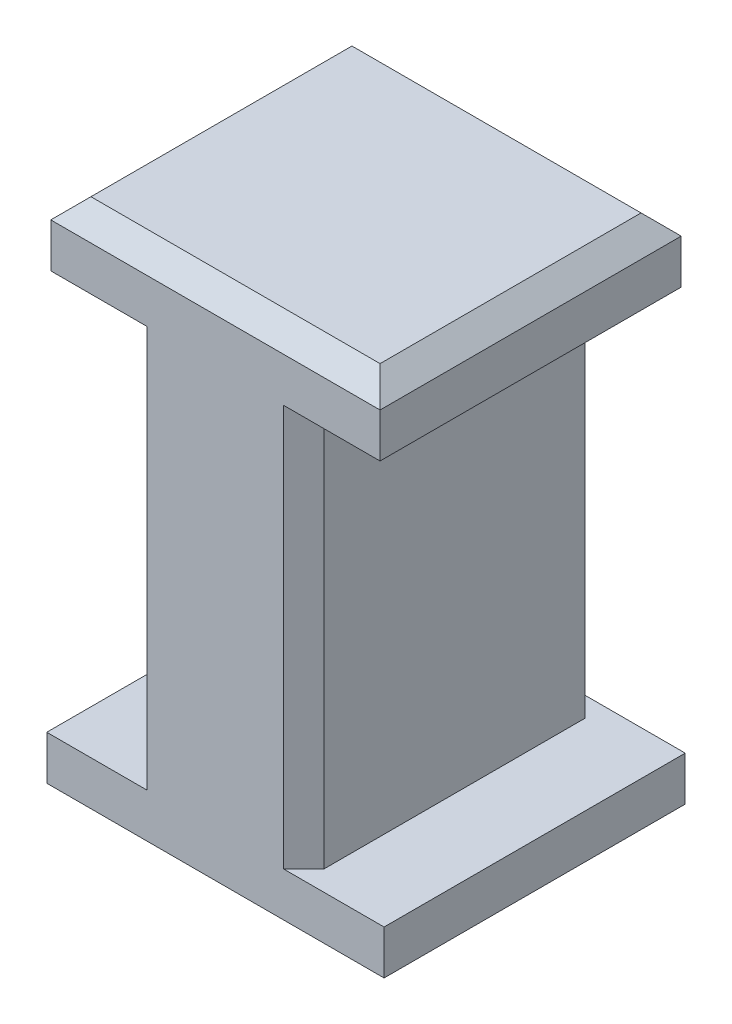
ISO-10303-21;
HEADER;
FILE_DESCRIPTION(('STEP AP214'),'2;1');
FILE_NAME('part.step','',(''),(''),'','','');
FILE_SCHEMA(('AUTOMOTIVE_DESIGN { 1 0 10303 214 1 1 1 1 }'));
ENDSEC;
DATA;
#1=APPLICATION_CONTEXT('core data for automotive mechanical design processes');
#2=APPLICATION_PROTOCOL_DEFINITION('international standard','automotive_design',2000,#1);
#3=PRODUCT_CONTEXT('',#1,'mechanical');
#4=PRODUCT('Part','Part','',(#3));
#5=PRODUCT_RELATED_PRODUCT_CATEGORY('part','',(#4));
#6=PRODUCT_DEFINITION_FORMATION('','',#4);
#7=PRODUCT_DEFINITION_CONTEXT('part definition',#1,'design');
#8=PRODUCT_DEFINITION('design','',#6,#7);
#9=PRODUCT_DEFINITION_SHAPE('','',#8);
#10=(LENGTH_UNIT() NAMED_UNIT(*) SI_UNIT(.MILLI.,.METRE.));
#11=(NAMED_UNIT(*) PLANE_ANGLE_UNIT() SI_UNIT($,.RADIAN.));
#12=(NAMED_UNIT(*) SI_UNIT($,.STERADIAN.) SOLID_ANGLE_UNIT());
#13=UNCERTAINTY_MEASURE_WITH_UNIT(LENGTH_MEASURE(1.E-05),#10,'distance_accuracy_value','');
#14=(GEOMETRIC_REPRESENTATION_CONTEXT(3) GLOBAL_UNCERTAINTY_ASSIGNED_CONTEXT((#13)) GLOBAL_UNIT_ASSIGNED_CONTEXT((#10,
#11,#12)) REPRESENTATION_CONTEXT('',''));
#15=CARTESIAN_POINT('',(0.,0.,0.));
#16=DIRECTION('',(0.,0.,1.));
#17=DIRECTION('',(1.,0.,0.));
#18=AXIS2_PLACEMENT_3D('',#15,#16,#17);
#19=CARTESIAN_POINT('',(8.2,23.2,15.));
#20=DIRECTION('',(-1.,0.,0.));
#21=DIRECTION('',(0.,0.,1.));
#22=AXIS2_PLACEMENT_3D('',#19,#20,#21);
#23=PLANE('',#22);
#24=DIRECTION('',(0.,1.,0.));
#25=VECTOR('',#24,1.);
#26=CARTESIAN_POINT('',(8.2,23.2,0.));
#27=LINE('',#26,#25);
#28=CARTESIAN_POINT('',(8.2,23.2,0.));
#29=VERTEX_POINT('',#28);
#30=CARTESIAN_POINT('',(8.2,25.4,0.));
#31=VERTEX_POINT('',#30);
#32=EDGE_CURVE('E216',#29,#31,#27,.T.);
#33=ORIENTED_EDGE('',*,*,#32,.T.);
#34=DIRECTION('',(0.,0.,1.));
#35=VECTOR('',#34,1.);
#36=CARTESIAN_POINT('',(8.2,25.4,15.));
#37=LINE('',#36,#35);
#38=CARTESIAN_POINT('',(8.2,25.4,15.));
#39=VERTEX_POINT('',#38);
#40=EDGE_CURVE('E260',#31,#39,#37,.T.);
#41=ORIENTED_EDGE('',*,*,#40,.T.);
#42=DIRECTION('',(0.,1.,0.));
#43=VECTOR('',#42,1.);
#44=CARTESIAN_POINT('',(8.2,23.2,15.));
#45=LINE('',#44,#43);
#46=CARTESIAN_POINT('',(8.2,23.2,15.));
#47=VERTEX_POINT('',#46);
#48=EDGE_CURVE('E196',#47,#39,#45,.T.);
#49=ORIENTED_EDGE('',*,*,#48,.F.);
#50=DIRECTION('',(0.,0.,-1.));
#51=VECTOR('',#50,1.);
#52=CARTESIAN_POINT('',(8.2,23.2,15.));
#53=LINE('',#52,#51);
#54=EDGE_CURVE('E215',#47,#29,#53,.T.);
#55=ORIENTED_EDGE('',*,*,#54,.T.);
#56=EDGE_LOOP('',(#33,#41,#49,#55));
#57=FACE_BOUND('',#56,.T.);
#58=ADVANCED_FACE('F34',(#57),#23,.F.);
#59=CARTESIAN_POINT('',(8.2,26.4,15.));
#60=DIRECTION('',(0.,-1.,0.));
#61=DIRECTION('',(0.,0.,-1.));
#62=AXIS2_PLACEMENT_3D('',#59,#60,#61);
#63=PLANE('',#62);
#64=DIRECTION('',(1.,0.,0.));
#65=VECTOR('',#64,1.);
#66=CARTESIAN_POINT('',(8.2,26.4,14.));
#67=LINE('',#66,#65);
#68=CARTESIAN_POINT('',(-7.19999999999999,26.4,14.));
#69=VERTEX_POINT('',#68);
#70=CARTESIAN_POINT('',(7.19999999999999,26.4,14.));
#71=VERTEX_POINT('',#70);
#72=EDGE_CURVE('E255',#69,#71,#67,.T.);
#73=ORIENTED_EDGE('',*,*,#72,.T.);
#74=DIRECTION('',(0.,0.,-1.));
#75=VECTOR('',#74,1.);
#76=CARTESIAN_POINT('',(7.19999999999999,26.4,15.));
#77=LINE('',#76,#75);
#78=CARTESIAN_POINT('',(7.19999999999999,26.4,1.));
#79=VERTEX_POINT('',#78);
#80=EDGE_CURVE('E257',#71,#79,#77,.T.);
#81=ORIENTED_EDGE('',*,*,#80,.T.);
#82=DIRECTION('',(-1.,0.,0.));
#83=VECTOR('',#82,1.);
#84=CARTESIAN_POINT('',(8.2,26.4,1.));
#85=LINE('',#84,#83);
#86=CARTESIAN_POINT('',(-7.19999999999999,26.4,1.));
#87=VERTEX_POINT('',#86);
#88=EDGE_CURVE('E185',#79,#87,#85,.T.);
#89=ORIENTED_EDGE('',*,*,#88,.T.);
#90=DIRECTION('',(0.,0.,1.));
#91=VECTOR('',#90,1.);
#92=CARTESIAN_POINT('',(-7.19999999999999,26.4,15.));
#93=LINE('',#92,#91);
#94=EDGE_CURVE('E253',#87,#69,#93,.T.);
#95=ORIENTED_EDGE('',*,*,#94,.T.);
#96=EDGE_LOOP('',(#73,#81,#89,#95));
#97=FACE_BOUND('',#96,.T.);
#98=ADVANCED_FACE('F384',(#97),#63,.F.);
#99=CARTESIAN_POINT('',(-8.2,23.2,15.));
#100=DIRECTION('',(-1.,0.,0.));
#101=DIRECTION('',(0.,0.,1.));
#102=AXIS2_PLACEMENT_3D('',#99,#100,#101);
#103=PLANE('',#102);
#104=DIRECTION('',(0.,1.,0.));
#105=VECTOR('',#104,1.);
#106=CARTESIAN_POINT('',(-8.2,23.2,15.));
#107=LINE('',#106,#105);
#108=CARTESIAN_POINT('',(-8.2,23.2,15.));
#109=VERTEX_POINT('',#108);
#110=CARTESIAN_POINT('',(-8.2,25.4,15.));
#111=VERTEX_POINT('',#110);
#112=EDGE_CURVE('E178',#109,#111,#107,.T.);
#113=ORIENTED_EDGE('',*,*,#112,.T.);
#114=DIRECTION('',(0.,0.,-1.));
#115=VECTOR('',#114,1.);
#116=CARTESIAN_POINT('',(-8.2,25.4,0.));
#117=LINE('',#116,#115);
#118=CARTESIAN_POINT('',(-8.2,25.4,0.));
#119=VERTEX_POINT('',#118);
#120=EDGE_CURVE('E271',#111,#119,#117,.T.);
#121=ORIENTED_EDGE('',*,*,#120,.T.);
#122=DIRECTION('',(0.,1.,0.));
#123=VECTOR('',#122,1.);
#124=CARTESIAN_POINT('',(-8.2,23.2,0.));
#125=LINE('',#124,#123);
#126=CARTESIAN_POINT('',(-8.2,23.2,0.));
#127=VERTEX_POINT('',#126);
#128=EDGE_CURVE('E181',#127,#119,#125,.T.);
#129=ORIENTED_EDGE('',*,*,#128,.F.);
#130=DIRECTION('',(0.,0.,-1.));
#131=VECTOR('',#130,1.);
#132=CARTESIAN_POINT('',(-8.2,23.2,15.));
#133=LINE('',#132,#131);
#134=EDGE_CURVE('E175',#109,#127,#133,.T.);
#135=ORIENTED_EDGE('',*,*,#134,.F.);
#136=EDGE_LOOP('',(#113,#121,#129,#135));
#137=FACE_BOUND('',#136,.T.);
#138=ADVANCED_FACE('F177',(#137),#103,.T.);
#139=CARTESIAN_POINT('',(-4.4,23.2,15.));
#140=DIRECTION('',(0.,-1.,0.));
#141=DIRECTION('',(1.,0.,0.));
#142=AXIS2_PLACEMENT_3D('',#139,#140,#141);
#143=PLANE('',#142);
#144=DIRECTION('',(-1.,0.,0.));
#145=VECTOR('',#144,1.);
#146=CARTESIAN_POINT('',(-4.4,23.2,0.));
#147=LINE('',#146,#145);
#148=CARTESIAN_POINT('',(-3.4,23.2,0.));
#149=VERTEX_POINT('',#148);
#150=EDGE_CURVE('E221',#149,#127,#147,.T.);
#151=ORIENTED_EDGE('',*,*,#150,.F.);
#152=DIRECTION('',(-0.707106781186546,0.,0.707106781186549));
#153=VECTOR('',#152,1.);
#154=CARTESIAN_POINT('',(-3.40000000000001,23.2,0.));
#155=LINE('',#154,#153);
#156=CARTESIAN_POINT('',(-4.4,23.2,1.00000000000001));
#157=VERTEX_POINT('',#156);
#158=EDGE_CURVE('E313',#149,#157,#155,.T.);
#159=ORIENTED_EDGE('',*,*,#158,.T.);
#160=DIRECTION('',(0.,0.,-1.));
#161=VECTOR('',#160,1.);
#162=CARTESIAN_POINT('',(-4.4,23.2,15.));
#163=LINE('',#162,#161);
#164=CARTESIAN_POINT('',(-4.4,23.2,14.));
#165=VERTEX_POINT('',#164);
#166=EDGE_CURVE('E186',#165,#157,#163,.T.);
#167=ORIENTED_EDGE('',*,*,#166,.F.);
#168=DIRECTION('',(-0.707106781186549,0.,-0.707106781186546));
#169=VECTOR('',#168,1.);
#170=CARTESIAN_POINT('',(-4.40000000000001,23.2,14.));
#171=LINE('',#170,#169);
#172=CARTESIAN_POINT('',(-3.39999999999999,23.2,15.));
#173=VERTEX_POINT('',#172);
#174=EDGE_CURVE('E200',#165,#173,#171,.F.);
#175=ORIENTED_EDGE('',*,*,#174,.T.);
#176=DIRECTION('',(-1.,0.,0.));
#177=VECTOR('',#176,1.);
#178=CARTESIAN_POINT('',(-4.4,23.2,15.));
#179=LINE('',#178,#177);
#180=EDGE_CURVE('E192',#173,#109,#179,.T.);
#181=ORIENTED_EDGE('',*,*,#180,.T.);
#182=ORIENTED_EDGE('',*,*,#134,.T.);
#183=EDGE_LOOP('',(#151,#159,#167,#175,#181,#182));
#184=FACE_BOUND('',#183,.T.);
#185=ADVANCED_FACE('F198',(#184),#143,.T.);
#186=CARTESIAN_POINT('',(-4.4,3.2,15.));
#187=DIRECTION('',(-1.,0.,0.));
#188=DIRECTION('',(0.,0.,1.));
#189=AXIS2_PLACEMENT_3D('',#186,#187,#188);
#190=PLANE('',#189);
#191=DIRECTION('',(0.,0.,-1.));
#192=VECTOR('',#191,1.);
#193=CARTESIAN_POINT('',(-4.4,3.2,15.));
#194=LINE('',#193,#192);
#195=CARTESIAN_POINT('',(-4.4,3.2,14.));
#196=VERTEX_POINT('',#195);
#197=CARTESIAN_POINT('',(-4.4,3.2,1.00000000000001));
#198=VERTEX_POINT('',#197);
#199=EDGE_CURVE('E247',#196,#198,#194,.T.);
#200=ORIENTED_EDGE('',*,*,#199,.F.);
#201=DIRECTION('',(0.,1.,0.));
#202=VECTOR('',#201,1.);
#203=CARTESIAN_POINT('',(-4.4,3.2,14.));
#204=LINE('',#203,#202);
#205=EDGE_CURVE('E285',#196,#165,#204,.T.);
#206=ORIENTED_EDGE('',*,*,#205,.T.);
#207=ORIENTED_EDGE('',*,*,#166,.T.);
#208=DIRECTION('',(0.,-1.,0.));
#209=VECTOR('',#208,1.);
#210=CARTESIAN_POINT('',(-4.4,3.2,1.00000000000001));
#211=LINE('',#210,#209);
#212=EDGE_CURVE('E283',#157,#198,#211,.T.);
#213=ORIENTED_EDGE('',*,*,#212,.T.);
#214=EDGE_LOOP('',(#200,#206,#207,#213));
#215=FACE_BOUND('',#214,.T.);
#216=ADVANCED_FACE('F557',(#215),#190,.T.);
#217=CARTESIAN_POINT('',(-8.4,3.2,15.));
#218=DIRECTION('',(0.,1.,0.));
#219=DIRECTION('',(-1.,0.,0.));
#220=AXIS2_PLACEMENT_3D('',#217,#218,#219);
#221=PLANE('',#220);
#222=DIRECTION('',(1.,0.,0.));
#223=VECTOR('',#222,1.);
#224=CARTESIAN_POINT('',(-8.4,3.2,0.));
#225=LINE('',#224,#223);
#226=CARTESIAN_POINT('',(-8.4,3.2,0.));
#227=VERTEX_POINT('',#226);
#228=CARTESIAN_POINT('',(-3.4,3.2,0.));
#229=VERTEX_POINT('',#228);
#230=EDGE_CURVE('E223',#227,#229,#225,.T.);
#231=ORIENTED_EDGE('',*,*,#230,.F.);
#232=DIRECTION('',(0.,0.,-1.));
#233=VECTOR('',#232,1.);
#234=CARTESIAN_POINT('',(-8.4,3.2,15.));
#235=LINE('',#234,#233);
#236=CARTESIAN_POINT('',(-8.4,3.2,15.));
#237=VERTEX_POINT('',#236);
#238=EDGE_CURVE('E244',#237,#227,#235,.T.);
#239=ORIENTED_EDGE('',*,*,#238,.F.);
#240=DIRECTION('',(1.,0.,0.));
#241=VECTOR('',#240,1.);
#242=CARTESIAN_POINT('',(-8.4,3.2,15.));
#243=LINE('',#242,#241);
#244=CARTESIAN_POINT('',(-3.39999999999999,3.2,15.));
#245=VERTEX_POINT('',#244);
#246=EDGE_CURVE('E202',#237,#245,#243,.T.);
#247=ORIENTED_EDGE('',*,*,#246,.T.);
#248=DIRECTION('',(0.707106781186549,0.,0.707106781186546));
#249=VECTOR('',#248,1.);
#250=CARTESIAN_POINT('',(-4.4,3.2,14.));
#251=LINE('',#250,#249);
#252=EDGE_CURVE('E306',#245,#196,#251,.F.);
#253=ORIENTED_EDGE('',*,*,#252,.T.);
#254=ORIENTED_EDGE('',*,*,#199,.T.);
#255=DIRECTION('',(0.707106781186546,0.,-0.707106781186549));
#256=VECTOR('',#255,1.);
#257=CARTESIAN_POINT('',(-3.4,3.2,0.));
#258=LINE('',#257,#256);
#259=EDGE_CURVE('E315',#198,#229,#258,.T.);
#260=ORIENTED_EDGE('',*,*,#259,.T.);
#261=EDGE_LOOP('',(#231,#239,#247,#253,#254,#260));
#262=FACE_BOUND('',#261,.T.);
#263=ADVANCED_FACE('F369',(#262),#221,.T.);
#264=CARTESIAN_POINT('',(-8.4,0.,15.));
#265=DIRECTION('',(-1.,0.,0.));
#266=DIRECTION('',(0.,0.,1.));
#267=AXIS2_PLACEMENT_3D('',#264,#265,#266);
#268=PLANE('',#267);
#269=DIRECTION('',(0.,1.,0.));
#270=VECTOR('',#269,1.);
#271=CARTESIAN_POINT('',(-8.4,0.,0.));
#272=LINE('',#271,#270);
#273=CARTESIAN_POINT('',(-8.4,1.,0.));
#274=VERTEX_POINT('',#273);
#275=EDGE_CURVE('E225',#274,#227,#272,.T.);
#276=ORIENTED_EDGE('',*,*,#275,.F.);
#277=DIRECTION('',(0.,0.,1.));
#278=VECTOR('',#277,1.);
#279=CARTESIAN_POINT('',(-8.4,1.,15.));
#280=LINE('',#279,#278);
#281=CARTESIAN_POINT('',(-8.4,1.,15.));
#282=VERTEX_POINT('',#281);
#283=EDGE_CURVE('E300',#274,#282,#280,.T.);
#284=ORIENTED_EDGE('',*,*,#283,.T.);
#285=DIRECTION('',(0.,1.,0.));
#286=VECTOR('',#285,1.);
#287=CARTESIAN_POINT('',(-8.4,0.,15.));
#288=LINE('',#287,#286);
#289=EDGE_CURVE('E204',#282,#237,#288,.T.);
#290=ORIENTED_EDGE('',*,*,#289,.T.);
#291=ORIENTED_EDGE('',*,*,#238,.T.);
#292=EDGE_LOOP('',(#276,#284,#290,#291));
#293=FACE_BOUND('',#292,.T.);
#294=ADVANCED_FACE('F366',(#293),#268,.T.);
#295=CARTESIAN_POINT('',(-8.4,0.,15.));
#296=DIRECTION('',(0.,1.,0.));
#297=DIRECTION('',(0.,0.,1.));
#298=AXIS2_PLACEMENT_3D('',#295,#296,#297);
#299=PLANE('',#298);
#300=DIRECTION('',(-1.,0.,0.));
#301=VECTOR('',#300,1.);
#302=CARTESIAN_POINT('',(-8.4,0.,14.));
#303=LINE('',#302,#301);
#304=CARTESIAN_POINT('',(7.39999999999999,0.,14.));
#305=VERTEX_POINT('',#304);
#306=CARTESIAN_POINT('',(-7.39999999999999,0.,14.));
#307=VERTEX_POINT('',#306);
#308=EDGE_CURVE('E293',#305,#307,#303,.T.);
#309=ORIENTED_EDGE('',*,*,#308,.T.);
#310=DIRECTION('',(0.,0.,-1.));
#311=VECTOR('',#310,1.);
#312=CARTESIAN_POINT('',(-7.39999999999999,0.,0.));
#313=LINE('',#312,#311);
#314=CARTESIAN_POINT('',(-7.39999999999999,0.,1.00000000000001));
#315=VERTEX_POINT('',#314);
#316=EDGE_CURVE('E298',#307,#315,#313,.T.);
#317=ORIENTED_EDGE('',*,*,#316,.T.);
#318=DIRECTION('',(1.,0.,0.));
#319=VECTOR('',#318,1.);
#320=CARTESIAN_POINT('',(-8.4,0.,1.00000000000001));
#321=LINE('',#320,#319);
#322=CARTESIAN_POINT('',(7.39999999999999,0.,1.00000000000001));
#323=VERTEX_POINT('',#322);
#324=EDGE_CURVE('E59',#315,#323,#321,.T.);
#325=ORIENTED_EDGE('',*,*,#324,.T.);
#326=DIRECTION('',(0.,0.,1.));
#327=VECTOR('',#326,1.);
#328=CARTESIAN_POINT('',(7.39999999999999,0.,15.));
#329=LINE('',#328,#327);
#330=EDGE_CURVE('E295',#323,#305,#329,.T.);
#331=ORIENTED_EDGE('',*,*,#330,.T.);
#332=EDGE_LOOP('',(#309,#317,#325,#331));
#333=FACE_BOUND('',#332,.T.);
#334=ADVANCED_FACE('F374',(#333),#299,.F.);
#335=CARTESIAN_POINT('',(8.4,0.,15.));
#336=DIRECTION('',(-1.,0.,0.));
#337=DIRECTION('',(0.,0.,1.));
#338=AXIS2_PLACEMENT_3D('',#335,#336,#337);
#339=PLANE('',#338);
#340=DIRECTION('',(0.,1.,0.));
#341=VECTOR('',#340,1.);
#342=CARTESIAN_POINT('',(8.4,0.,15.));
#343=LINE('',#342,#341);
#344=CARTESIAN_POINT('',(8.4,1.,15.));
#345=VERTEX_POINT('',#344);
#346=CARTESIAN_POINT('',(8.4,3.2,15.));
#347=VERTEX_POINT('',#346);
#348=EDGE_CURVE('E209',#345,#347,#343,.T.);
#349=ORIENTED_EDGE('',*,*,#348,.F.);
#350=DIRECTION('',(0.,0.,-1.));
#351=VECTOR('',#350,1.);
#352=CARTESIAN_POINT('',(8.4,1.,15.));
#353=LINE('',#352,#351);
#354=CARTESIAN_POINT('',(8.4,1.,0.));
#355=VERTEX_POINT('',#354);
#356=EDGE_CURVE('E303',#345,#355,#353,.T.);
#357=ORIENTED_EDGE('',*,*,#356,.T.);
#358=DIRECTION('',(0.,1.,0.));
#359=VECTOR('',#358,1.);
#360=CARTESIAN_POINT('',(8.4,0.,0.));
#361=LINE('',#360,#359);
#362=CARTESIAN_POINT('',(8.4,3.2,0.));
#363=VERTEX_POINT('',#362);
#364=EDGE_CURVE('E227',#355,#363,#361,.T.);
#365=ORIENTED_EDGE('',*,*,#364,.T.);
#366=DIRECTION('',(0.,0.,-1.));
#367=VECTOR('',#366,1.);
#368=CARTESIAN_POINT('',(8.4,3.2,15.));
#369=LINE('',#368,#367);
#370=EDGE_CURVE('E241',#347,#363,#369,.T.);
#371=ORIENTED_EDGE('',*,*,#370,.F.);
#372=EDGE_LOOP('',(#349,#357,#365,#371));
#373=FACE_BOUND('',#372,.T.);
#374=ADVANCED_FACE('F348',(#373),#339,.F.);
#375=CARTESIAN_POINT('',(8.4,3.2,15.));
#376=DIRECTION('',(0.,-1.,0.));
#377=DIRECTION('',(1.,0.,0.));
#378=AXIS2_PLACEMENT_3D('',#375,#376,#377);
#379=PLANE('',#378);
#380=DIRECTION('',(-1.,0.,0.));
#381=VECTOR('',#380,1.);
#382=CARTESIAN_POINT('',(8.4,3.2,0.));
#383=LINE('',#382,#381);
#384=CARTESIAN_POINT('',(3.39999999999999,3.2,0.));
#385=VERTEX_POINT('',#384);
#386=EDGE_CURVE('E229',#363,#385,#383,.T.);
#387=ORIENTED_EDGE('',*,*,#386,.T.);
#388=DIRECTION('',(-0.707106781186549,0.,-0.707106781186546));
#389=VECTOR('',#388,1.);
#390=CARTESIAN_POINT('',(13.4,3.2,9.99999999999998));
#391=LINE('',#390,#389);
#392=CARTESIAN_POINT('',(4.4,3.2,1.));
#393=VERTEX_POINT('',#392);
#394=EDGE_CURVE('E11',#385,#393,#391,.F.);
#395=ORIENTED_EDGE('',*,*,#394,.T.);
#396=DIRECTION('',(0.,0.,-1.));
#397=VECTOR('',#396,1.);
#398=CARTESIAN_POINT('',(4.4,3.2,15.));
#399=LINE('',#398,#397);
#400=CARTESIAN_POINT('',(4.4,3.2,14.));
#401=VERTEX_POINT('',#400);
#402=EDGE_CURVE('E238',#401,#393,#399,.T.);
#403=ORIENTED_EDGE('',*,*,#402,.F.);
#404=DIRECTION('',(-0.707106781186546,0.,0.707106781186549));
#405=VECTOR('',#404,1.);
#406=CARTESIAN_POINT('',(5.89999999999999,3.2,12.5));
#407=LINE('',#406,#405);
#408=CARTESIAN_POINT('',(3.4,3.2,15.));
#409=VERTEX_POINT('',#408);
#410=EDGE_CURVE('E310',#401,#409,#407,.T.);
#411=ORIENTED_EDGE('',*,*,#410,.T.);
#412=DIRECTION('',(-1.,0.,0.));
#413=VECTOR('',#412,1.);
#414=CARTESIAN_POINT('',(8.4,3.2,15.));
#415=LINE('',#414,#413);
#416=EDGE_CURVE('E211',#347,#409,#415,.T.);
#417=ORIENTED_EDGE('',*,*,#416,.F.);
#418=ORIENTED_EDGE('',*,*,#370,.T.);
#419=EDGE_LOOP('',(#387,#395,#403,#411,#417,#418));
#420=FACE_BOUND('',#419,.T.);
#421=ADVANCED_FACE('F357',(#420),#379,.F.);
#422=CARTESIAN_POINT('',(4.4,3.2,15.));
#423=DIRECTION('',(-1.,0.,0.));
#424=DIRECTION('',(0.,0.,1.));
#425=AXIS2_PLACEMENT_3D('',#422,#423,#424);
#426=PLANE('',#425);
#427=DIRECTION('',(0.,0.,-1.));
#428=VECTOR('',#427,1.);
#429=CARTESIAN_POINT('',(4.4,23.2,15.));
#430=LINE('',#429,#428);
#431=CARTESIAN_POINT('',(4.4,23.2,14.));
#432=VERTEX_POINT('',#431);
#433=CARTESIAN_POINT('',(4.4,23.2,1.));
#434=VERTEX_POINT('',#433);
#435=EDGE_CURVE('E235',#432,#434,#430,.T.);
#436=ORIENTED_EDGE('',*,*,#435,.F.);
#437=DIRECTION('',(0.,-1.,0.));
#438=VECTOR('',#437,1.);
#439=CARTESIAN_POINT('',(4.4,3.2,14.));
#440=LINE('',#439,#438);
#441=EDGE_CURVE('E291',#432,#401,#440,.T.);
#442=ORIENTED_EDGE('',*,*,#441,.T.);
#443=ORIENTED_EDGE('',*,*,#402,.T.);
#444=DIRECTION('',(0.,1.,0.));
#445=VECTOR('',#444,1.);
#446=CARTESIAN_POINT('',(4.4,3.2,1.));
#447=LINE('',#446,#445);
#448=EDGE_CURVE('E288',#393,#434,#447,.T.);
#449=ORIENTED_EDGE('',*,*,#448,.T.);
#450=EDGE_LOOP('',(#436,#442,#443,#449));
#451=FACE_BOUND('',#450,.T.);
#452=ADVANCED_FACE('F519',(#451),#426,.F.);
#453=CARTESIAN_POINT('',(4.4,23.2,15.));
#454=DIRECTION('',(0.,1.,0.));
#455=DIRECTION('',(-1.,0.,0.));
#456=AXIS2_PLACEMENT_3D('',#453,#454,#455);
#457=PLANE('',#456);
#458=DIRECTION('',(1.,0.,0.));
#459=VECTOR('',#458,1.);
#460=CARTESIAN_POINT('',(4.4,23.2,0.));
#461=LINE('',#460,#459);
#462=CARTESIAN_POINT('',(3.39999999999999,23.2,0.));
#463=VERTEX_POINT('',#462);
#464=EDGE_CURVE('E231',#463,#29,#461,.T.);
#465=ORIENTED_EDGE('',*,*,#464,.T.);
#466=ORIENTED_EDGE('',*,*,#54,.F.);
#467=DIRECTION('',(1.,0.,0.));
#468=VECTOR('',#467,1.);
#469=CARTESIAN_POINT('',(4.4,23.2,15.));
#470=LINE('',#469,#468);
#471=CARTESIAN_POINT('',(3.4,23.2,15.));
#472=VERTEX_POINT('',#471);
#473=EDGE_CURVE('E213',#472,#47,#470,.T.);
#474=ORIENTED_EDGE('',*,*,#473,.F.);
#475=DIRECTION('',(0.707106781186546,0.,-0.707106781186549));
#476=VECTOR('',#475,1.);
#477=CARTESIAN_POINT('',(3.9,23.2,14.5));
#478=LINE('',#477,#476);
#479=EDGE_CURVE('E308',#472,#432,#478,.T.);
#480=ORIENTED_EDGE('',*,*,#479,.T.);
#481=ORIENTED_EDGE('',*,*,#435,.T.);
#482=DIRECTION('',(0.707106781186549,0.,0.707106781186546));
#483=VECTOR('',#482,1.);
#484=CARTESIAN_POINT('',(11.4,23.2,7.99999999999998));
#485=LINE('',#484,#483);
#486=EDGE_CURVE('E44',#434,#463,#485,.F.);
#487=ORIENTED_EDGE('',*,*,#486,.T.);
#488=EDGE_LOOP('',(#465,#466,#474,#480,#481,#487));
#489=FACE_BOUND('',#488,.T.);
#490=ADVANCED_FACE('F512',(#489),#457,.F.);
#491=CARTESIAN_POINT('',(0.,0.,15.));
#492=DIRECTION('',(0.,0.,1.));
#493=DIRECTION('',(1.,0.,0.));
#494=AXIS2_PLACEMENT_3D('',#491,#492,#493);
#495=PLANE('',#494);
#496=ORIENTED_EDGE('',*,*,#48,.T.);
#497=DIRECTION('',(-1.,0.,0.));
#498=VECTOR('',#497,1.);
#499=CARTESIAN_POINT('',(-8.2,25.4,15.));
#500=LINE('',#499,#498);
#501=EDGE_CURVE('E195',#39,#111,#500,.T.);
#502=ORIENTED_EDGE('',*,*,#501,.T.);
#503=ORIENTED_EDGE('',*,*,#112,.F.);
#504=ORIENTED_EDGE('',*,*,#180,.F.);
#505=DIRECTION('',(0.,-1.,0.));
#506=VECTOR('',#505,1.);
#507=CARTESIAN_POINT('',(-3.39999999999999,0.,15.));
#508=LINE('',#507,#506);
#509=EDGE_CURVE('E268',#173,#245,#508,.T.);
#510=ORIENTED_EDGE('',*,*,#509,.T.);
#511=ORIENTED_EDGE('',*,*,#246,.F.);
#512=ORIENTED_EDGE('',*,*,#289,.F.);
#513=DIRECTION('',(1.,0.,0.));
#514=VECTOR('',#513,1.);
#515=CARTESIAN_POINT('',(8.4,1.,15.));
#516=LINE('',#515,#514);
#517=EDGE_CURVE('E263',#282,#345,#516,.T.);
#518=ORIENTED_EDGE('',*,*,#517,.T.);
#519=ORIENTED_EDGE('',*,*,#348,.T.);
#520=ORIENTED_EDGE('',*,*,#416,.T.);
#521=DIRECTION('',(0.,1.,0.));
#522=VECTOR('',#521,1.);
#523=CARTESIAN_POINT('',(3.4,23.2,15.));
#524=LINE('',#523,#522);
#525=EDGE_CURVE('E265',#409,#472,#524,.T.);
#526=ORIENTED_EDGE('',*,*,#525,.T.);
#527=ORIENTED_EDGE('',*,*,#473,.T.);
#528=EDGE_LOOP('',(#496,#502,#503,#504,#510,#511,#512,#518,#519,#520,#526,#527));
#529=FACE_BOUND('',#528,.T.);
#530=ADVANCED_FACE('F190',(#529),#495,.T.);
#531=CARTESIAN_POINT('',(0.,0.,0.));
#532=DIRECTION('',(0.,0.,1.));
#533=DIRECTION('',(1.,0.,0.));
#534=AXIS2_PLACEMENT_3D('',#531,#532,#533);
#535=PLANE('',#534);
#536=ORIENTED_EDGE('',*,*,#128,.T.);
#537=DIRECTION('',(1.,0.,0.));
#538=VECTOR('',#537,1.);
#539=CARTESIAN_POINT('',(0.,25.4,0.));
#540=LINE('',#539,#538);
#541=EDGE_CURVE('E281',#119,#31,#540,.T.);
#542=ORIENTED_EDGE('',*,*,#541,.T.);
#543=ORIENTED_EDGE('',*,*,#32,.F.);
#544=ORIENTED_EDGE('',*,*,#464,.F.);
#545=DIRECTION('',(0.,-1.,0.));
#546=VECTOR('',#545,1.);
#547=CARTESIAN_POINT('',(3.39999999999999,0.,0.));
#548=LINE('',#547,#546);
#549=EDGE_CURVE('E275',#463,#385,#548,.T.);
#550=ORIENTED_EDGE('',*,*,#549,.T.);
#551=ORIENTED_EDGE('',*,*,#386,.F.);
#552=ORIENTED_EDGE('',*,*,#364,.F.);
#553=DIRECTION('',(-1.,0.,0.));
#554=VECTOR('',#553,1.);
#555=CARTESIAN_POINT('',(0.,1.,0.));
#556=LINE('',#555,#554);
#557=EDGE_CURVE('E273',#355,#274,#556,.T.);
#558=ORIENTED_EDGE('',*,*,#557,.T.);
#559=ORIENTED_EDGE('',*,*,#275,.T.);
#560=ORIENTED_EDGE('',*,*,#230,.T.);
#561=DIRECTION('',(0.,1.,0.));
#562=VECTOR('',#561,1.);
#563=CARTESIAN_POINT('',(-3.4,23.2,0.));
#564=LINE('',#563,#562);
#565=EDGE_CURVE('E278',#229,#149,#564,.T.);
#566=ORIENTED_EDGE('',*,*,#565,.T.);
#567=ORIENTED_EDGE('',*,*,#150,.T.);
#568=EDGE_LOOP('',(#536,#542,#543,#544,#550,#551,#552,#558,#559,#560,#566,#567));
#569=FACE_BOUND('',#568,.T.);
#570=ADVANCED_FACE('F352',(#569),#535,.F.);
#571=CARTESIAN_POINT('',(-8.2,25.4,15.));
#572=DIRECTION('',(-0.707106781186549,0.707106781186546,0.));
#573=DIRECTION('',(0.,0.,1.));
#574=AXIS2_PLACEMENT_3D('',#571,#572,#573);
#575=PLANE('',#574);
#576=DIRECTION('',(-0.577350269189625,-0.577350269189627,-0.577350269189625));
#577=VECTOR('',#576,1.);
#578=CARTESIAN_POINT('',(-2.06666666666667,31.5333333333333,6.13333333333332));
#579=LINE('',#578,#577);
#580=EDGE_CURVE('E324',#119,#87,#579,.F.);
#581=ORIENTED_EDGE('',*,*,#580,.F.);
#582=ORIENTED_EDGE('',*,*,#120,.F.);
#583=DIRECTION('',(0.577350269189625,0.577350269189627,-0.577350269189625));
#584=VECTOR('',#583,1.);
#585=CARTESIAN_POINT('',(-8.2,25.4,15.));
#586=LINE('',#585,#584);
#587=EDGE_CURVE('E219',#69,#111,#586,.F.);
#588=ORIENTED_EDGE('',*,*,#587,.F.);
#589=ORIENTED_EDGE('',*,*,#94,.F.);
#590=EDGE_LOOP('',(#581,#582,#588,#589));
#591=FACE_BOUND('',#590,.T.);
#592=ADVANCED_FACE('F417',(#591),#575,.T.);
#593=CARTESIAN_POINT('',(0.,25.4,15.));
#594=DIRECTION('',(0.,0.707106781186546,0.707106781186549));
#595=DIRECTION('',(1.,0.,0.));
#596=AXIS2_PLACEMENT_3D('',#593,#594,#595);
#597=PLANE('',#596);
#598=ORIENTED_EDGE('',*,*,#587,.T.);
#599=ORIENTED_EDGE('',*,*,#501,.F.);
#600=DIRECTION('',(0.577350269189625,-0.577350269189627,0.577350269189625));
#601=VECTOR('',#600,1.);
#602=CARTESIAN_POINT('',(5.46666666666667,28.1333333333333,12.2666666666667));
#603=LINE('',#602,#601);
#604=EDGE_CURVE('E322',#71,#39,#603,.T.);
#605=ORIENTED_EDGE('',*,*,#604,.F.);
#606=ORIENTED_EDGE('',*,*,#72,.F.);
#607=EDGE_LOOP('',(#598,#599,#605,#606));
#608=FACE_BOUND('',#607,.T.);
#609=ADVANCED_FACE('F410',(#608),#597,.T.);
#610=CARTESIAN_POINT('',(8.2,26.4,1.));
#611=DIRECTION('',(0.,-0.707106781186546,0.707106781186549));
#612=DIRECTION('',(-1.,0.,0.));
#613=AXIS2_PLACEMENT_3D('',#610,#611,#612);
#614=PLANE('',#613);
#615=ORIENTED_EDGE('',*,*,#580,.T.);
#616=ORIENTED_EDGE('',*,*,#88,.F.);
#617=DIRECTION('',(0.577350269189625,-0.577350269189627,-0.577350269189625));
#618=VECTOR('',#617,1.);
#619=CARTESIAN_POINT('',(7.53333333333333,26.0666666666667,0.66666666666667));
#620=LINE('',#619,#618);
#621=EDGE_CURVE('E320',#31,#79,#620,.F.);
#622=ORIENTED_EDGE('',*,*,#621,.F.);
#623=ORIENTED_EDGE('',*,*,#541,.F.);
#624=EDGE_LOOP('',(#615,#616,#622,#623));
#625=FACE_BOUND('',#624,.T.);
#626=ADVANCED_FACE('F403',(#625),#614,.F.);
#627=CARTESIAN_POINT('',(7.19999999999999,26.4,15.));
#628=DIRECTION('',(-0.707106781186549,-0.707106781186546,0.));
#629=DIRECTION('',(0.,0.,-1.));
#630=AXIS2_PLACEMENT_3D('',#627,#628,#629);
#631=PLANE('',#630);
#632=ORIENTED_EDGE('',*,*,#604,.T.);
#633=ORIENTED_EDGE('',*,*,#40,.F.);
#634=ORIENTED_EDGE('',*,*,#621,.T.);
#635=ORIENTED_EDGE('',*,*,#80,.F.);
#636=EDGE_LOOP('',(#632,#633,#634,#635));
#637=FACE_BOUND('',#636,.T.);
#638=ADVANCED_FACE('F395',(#637),#631,.F.);
#639=CARTESIAN_POINT('',(-4.4,3.2,14.));
#640=DIRECTION('',(0.707106781186546,0.,-0.707106781186549));
#641=DIRECTION('',(0.,1.,0.));
#642=AXIS2_PLACEMENT_3D('',#639,#640,#641);
#643=PLANE('',#642);
#644=ORIENTED_EDGE('',*,*,#252,.F.);
#645=ORIENTED_EDGE('',*,*,#509,.F.);
#646=ORIENTED_EDGE('',*,*,#174,.F.);
#647=ORIENTED_EDGE('',*,*,#205,.F.);
#648=EDGE_LOOP('',(#644,#645,#646,#647));
#649=FACE_BOUND('',#648,.T.);
#650=ADVANCED_FACE('F402',(#649),#643,.F.);
#651=CARTESIAN_POINT('',(3.4,0.,15.));
#652=DIRECTION('',(0.707106781186549,0.,0.707106781186546));
#653=DIRECTION('',(0.,-1.,0.));
#654=AXIS2_PLACEMENT_3D('',#651,#652,#653);
#655=PLANE('',#654);
#656=ORIENTED_EDGE('',*,*,#410,.F.);
#657=ORIENTED_EDGE('',*,*,#441,.F.);
#658=ORIENTED_EDGE('',*,*,#479,.F.);
#659=ORIENTED_EDGE('',*,*,#525,.F.);
#660=EDGE_LOOP('',(#656,#657,#658,#659));
#661=FACE_BOUND('',#660,.T.);
#662=ADVANCED_FACE('F429',(#661),#655,.T.);
#663=CARTESIAN_POINT('',(-3.4,0.,0.));
#664=DIRECTION('',(-0.707106781186549,0.,-0.707106781186546));
#665=DIRECTION('',(0.,-1.,0.));
#666=AXIS2_PLACEMENT_3D('',#663,#664,#665);
#667=PLANE('',#666);
#668=ORIENTED_EDGE('',*,*,#259,.F.);
#669=ORIENTED_EDGE('',*,*,#212,.F.);
#670=ORIENTED_EDGE('',*,*,#158,.F.);
#671=ORIENTED_EDGE('',*,*,#565,.F.);
#672=EDGE_LOOP('',(#668,#669,#670,#671));
#673=FACE_BOUND('',#672,.T.);
#674=ADVANCED_FACE('F436',(#673),#667,.T.);
#675=CARTESIAN_POINT('',(4.4,3.2,1.));
#676=DIRECTION('',(-0.707106781186546,0.,0.707106781186549));
#677=DIRECTION('',(0.,1.,0.));
#678=AXIS2_PLACEMENT_3D('',#675,#676,#677);
#679=PLANE('',#678);
#680=ORIENTED_EDGE('',*,*,#394,.F.);
#681=ORIENTED_EDGE('',*,*,#549,.F.);
#682=ORIENTED_EDGE('',*,*,#486,.F.);
#683=ORIENTED_EDGE('',*,*,#448,.F.);
#684=EDGE_LOOP('',(#680,#681,#682,#683));
#685=FACE_BOUND('',#684,.T.);
#686=ADVANCED_FACE('F443',(#685),#679,.F.);
#687=CARTESIAN_POINT('',(8.4,1.,15.));
#688=DIRECTION('',(-0.707106781186546,0.707106781186549,0.));
#689=DIRECTION('',(0.,0.,-1.));
#690=AXIS2_PLACEMENT_3D('',#687,#688,#689);
#691=PLANE('',#690);
#692=DIRECTION('',(0.577350269189626,0.577350269189624,-0.577350269189626));
#693=VECTOR('',#692,1.);
#694=CARTESIAN_POINT('',(3.39999999999999,-3.99999999999999,5.00000000000001));
#695=LINE('',#694,#693);
#696=EDGE_CURVE('E331',#355,#323,#695,.F.);
#697=ORIENTED_EDGE('',*,*,#696,.F.);
#698=ORIENTED_EDGE('',*,*,#356,.F.);
#699=DIRECTION('',(-0.577350269189626,-0.577350269189624,-0.577350269189626));
#700=VECTOR('',#699,1.);
#701=CARTESIAN_POINT('',(5.59999999999999,-1.79999999999999,12.2));
#702=LINE('',#701,#700);
#703=EDGE_CURVE('E39',#305,#345,#702,.F.);
#704=ORIENTED_EDGE('',*,*,#703,.F.);
#705=ORIENTED_EDGE('',*,*,#330,.F.);
#706=EDGE_LOOP('',(#697,#698,#704,#705));
#707=FACE_BOUND('',#706,.T.);
#708=ADVANCED_FACE('F37',(#707),#691,.F.);
#709=CARTESIAN_POINT('',(0.,1.,15.));
#710=DIRECTION('',(0.,-0.707106781186549,0.707106781186546));
#711=DIRECTION('',(-1.,0.,0.));
#712=AXIS2_PLACEMENT_3D('',#709,#710,#711);
#713=PLANE('',#712);
#714=ORIENTED_EDGE('',*,*,#703,.T.);
#715=ORIENTED_EDGE('',*,*,#517,.F.);
#716=DIRECTION('',(0.577350269189626,-0.577350269189624,-0.577350269189626));
#717=VECTOR('',#716,1.);
#718=CARTESIAN_POINT('',(-5.59999999999999,-1.79999999999999,12.2));
#719=LINE('',#718,#717);
#720=EDGE_CURVE('E330',#307,#282,#719,.F.);
#721=ORIENTED_EDGE('',*,*,#720,.F.);
#722=ORIENTED_EDGE('',*,*,#308,.F.);
#723=EDGE_LOOP('',(#714,#715,#721,#722));
#724=FACE_BOUND('',#723,.T.);
#725=ADVANCED_FACE('F341',(#724),#713,.T.);
#726=CARTESIAN_POINT('',(-8.4,0.,1.00000000000001));
#727=DIRECTION('',(0.,0.707106781186549,0.707106781186546));
#728=DIRECTION('',(1.,0.,0.));
#729=AXIS2_PLACEMENT_3D('',#726,#727,#728);
#730=PLANE('',#729);
#731=ORIENTED_EDGE('',*,*,#696,.T.);
#732=ORIENTED_EDGE('',*,*,#324,.F.);
#733=DIRECTION('',(0.577350269189626,-0.577350269189624,0.577350269189626));
#734=VECTOR('',#733,1.);
#735=CARTESIAN_POINT('',(-7.73333333333333,0.333333333333336,0.666666666666671));
#736=LINE('',#735,#734);
#737=EDGE_CURVE('E52',#274,#315,#736,.T.);
#738=ORIENTED_EDGE('',*,*,#737,.F.);
#739=ORIENTED_EDGE('',*,*,#557,.F.);
#740=EDGE_LOOP('',(#731,#732,#738,#739));
#741=FACE_BOUND('',#740,.T.);
#742=ADVANCED_FACE('F373',(#741),#730,.F.);
#743=CARTESIAN_POINT('',(-7.39999999999999,0.,15.));
#744=DIRECTION('',(-0.707106781186546,-0.707106781186549,0.));
#745=DIRECTION('',(0.,0.,1.));
#746=AXIS2_PLACEMENT_3D('',#743,#744,#745);
#747=PLANE('',#746);
#748=ORIENTED_EDGE('',*,*,#720,.T.);
#749=ORIENTED_EDGE('',*,*,#283,.F.);
#750=ORIENTED_EDGE('',*,*,#737,.T.);
#751=ORIENTED_EDGE('',*,*,#316,.F.);
#752=EDGE_LOOP('',(#748,#749,#750,#751));
#753=FACE_BOUND('',#752,.T.);
#754=ADVANCED_FACE('F372',(#753),#747,.T.);
#755=CLOSED_SHELL('',(#58,#98,#138,#185,#216,#263,#294,#334,#374,#421,#452,#490,#530,#570,#592,
#609,#626,#638,#650,#662,#674,#686,#708,#725,#742,#754));
#756=MANIFOLD_SOLID_BREP('B2',#755);
#757=ADVANCED_BREP_SHAPE_REPRESENTATION('',(#18,#756),#14);
#758=SHAPE_DEFINITION_REPRESENTATION(#9,#757);
ENDSEC;
END-ISO-10303-21;
